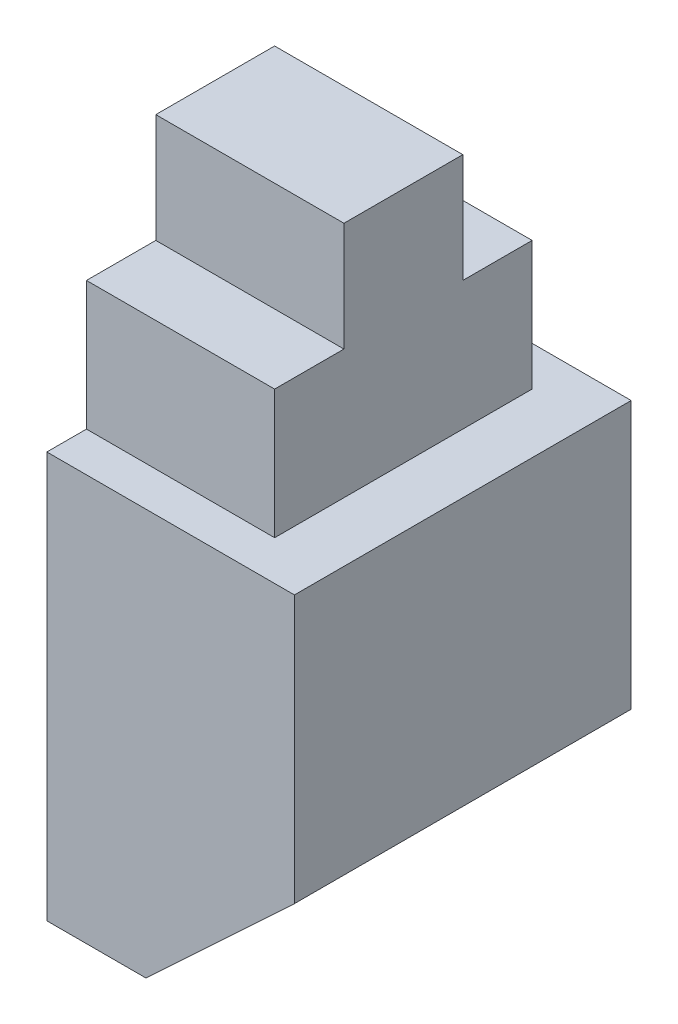
ISO-10303-21;
HEADER;
FILE_DESCRIPTION(('STEP AP214'),'2;1');
FILE_NAME('part.step','',(''),(''),'','','');
FILE_SCHEMA(('AUTOMOTIVE_DESIGN { 1 0 10303 214 1 1 1 1 }'));
ENDSEC;
DATA;
#1=APPLICATION_CONTEXT('core data for automotive mechanical design processes');
#2=APPLICATION_PROTOCOL_DEFINITION('international standard','automotive_design',2000,#1);
#3=PRODUCT_CONTEXT('',#1,'mechanical');
#4=PRODUCT('Part','Part','',(#3));
#5=PRODUCT_RELATED_PRODUCT_CATEGORY('part','',(#4));
#6=PRODUCT_DEFINITION_FORMATION('','',#4);
#7=PRODUCT_DEFINITION_CONTEXT('part definition',#1,'design');
#8=PRODUCT_DEFINITION('design','',#6,#7);
#9=PRODUCT_DEFINITION_SHAPE('','',#8);
#10=(LENGTH_UNIT() NAMED_UNIT(*) SI_UNIT(.MILLI.,.METRE.));
#11=(NAMED_UNIT(*) PLANE_ANGLE_UNIT() SI_UNIT($,.RADIAN.));
#12=(NAMED_UNIT(*) SI_UNIT($,.STERADIAN.) SOLID_ANGLE_UNIT());
#13=UNCERTAINTY_MEASURE_WITH_UNIT(LENGTH_MEASURE(1.E-05),#10,'distance_accuracy_value','');
#14=(GEOMETRIC_REPRESENTATION_CONTEXT(3) GLOBAL_UNCERTAINTY_ASSIGNED_CONTEXT((#13)) GLOBAL_UNIT_ASSIGNED_CONTEXT((#10,
#11,#12)) REPRESENTATION_CONTEXT('',''));
#15=CARTESIAN_POINT('',(0.,0.,0.));
#16=DIRECTION('',(0.,0.,1.));
#17=DIRECTION('',(1.,0.,0.));
#18=AXIS2_PLACEMENT_3D('',#15,#16,#17);
#19=CARTESIAN_POINT('',(-12.5,-20.5,-34.));
#20=DIRECTION('',(0.,-1.,0.));
#21=DIRECTION('',(0.,0.,-1.));
#22=AXIS2_PLACEMENT_3D('',#19,#20,#21);
#23=PLANE('',#22);
#24=DIRECTION('',(-1.,0.,0.));
#25=VECTOR('',#24,1.);
#26=CARTESIAN_POINT('',(12.5,-20.5,-8.));
#27=LINE('',#26,#25);
#28=CARTESIAN_POINT('',(-2.5,-20.5,-8.));
#29=VERTEX_POINT('',#28);
#30=CARTESIAN_POINT('',(-12.5,-20.5,-8.));
#31=VERTEX_POINT('',#30);
#32=EDGE_CURVE('E181',#29,#31,#27,.T.);
#33=ORIENTED_EDGE('',*,*,#32,.F.);
#34=DIRECTION('',(0.,0.,1.));
#35=VECTOR('',#34,1.);
#36=CARTESIAN_POINT('',(-2.5,-20.5,-34.));
#37=LINE('',#36,#35);
#38=CARTESIAN_POINT('',(-2.5,-20.5,0.));
#39=VERTEX_POINT('',#38);
#40=EDGE_CURVE('E281',#29,#39,#37,.T.);
#41=ORIENTED_EDGE('',*,*,#40,.T.);
#42=DIRECTION('',(1.,0.,0.));
#43=VECTOR('',#42,1.);
#44=CARTESIAN_POINT('',(-12.5,-20.5,0.));
#45=LINE('',#44,#43);
#46=CARTESIAN_POINT('',(-12.5,-20.5,0.));
#47=VERTEX_POINT('',#46);
#48=EDGE_CURVE('E270',#47,#39,#45,.T.);
#49=ORIENTED_EDGE('',*,*,#48,.F.);
#50=DIRECTION('',(0.,0.,1.));
#51=VECTOR('',#50,1.);
#52=CARTESIAN_POINT('',(-12.5,-20.5,-34.));
#53=LINE('',#52,#51);
#54=EDGE_CURVE('E282',#31,#47,#53,.T.);
#55=ORIENTED_EDGE('',*,*,#54,.F.);
#56=EDGE_LOOP('',(#33,#41,#49,#55));
#57=FACE_BOUND('',#56,.T.);
#58=ADVANCED_FACE('F35',(#57),#23,.T.);
#59=CARTESIAN_POINT('',(12.5,20.5,-34.));
#60=DIRECTION('',(0.,1.,0.));
#61=DIRECTION('',(0.,0.,1.));
#62=AXIS2_PLACEMENT_3D('',#59,#60,#61);
#63=PLANE('',#62);
#64=DIRECTION('',(-1.,0.,0.));
#65=VECTOR('',#64,1.);
#66=CARTESIAN_POINT('',(6.5,20.5,-30.));
#67=LINE('',#66,#65);
#68=CARTESIAN_POINT('',(6.5,20.5,-30.));
#69=VERTEX_POINT('',#68);
#70=CARTESIAN_POINT('',(-12.5,20.5,-30.));
#71=VERTEX_POINT('',#70);
#72=EDGE_CURVE('E233',#69,#71,#67,.T.);
#73=ORIENTED_EDGE('',*,*,#72,.F.);
#74=DIRECTION('',(0.,0.,1.));
#75=VECTOR('',#74,1.);
#76=CARTESIAN_POINT('',(6.5,20.5,-4.));
#77=LINE('',#76,#75);
#78=CARTESIAN_POINT('',(6.5,20.5,-4.));
#79=VERTEX_POINT('',#78);
#80=EDGE_CURVE('E189',#69,#79,#77,.T.);
#81=ORIENTED_EDGE('',*,*,#80,.T.);
#82=DIRECTION('',(-1.,0.,0.));
#83=VECTOR('',#82,1.);
#84=CARTESIAN_POINT('',(6.5,20.5,-4.));
#85=LINE('',#84,#83);
#86=CARTESIAN_POINT('',(-12.5,20.5,-4.));
#87=VERTEX_POINT('',#86);
#88=EDGE_CURVE('E214',#79,#87,#85,.T.);
#89=ORIENTED_EDGE('',*,*,#88,.T.);
#90=DIRECTION('',(0.,0.,1.));
#91=VECTOR('',#90,1.);
#92=CARTESIAN_POINT('',(-12.5,20.5,-34.));
#93=LINE('',#92,#91);
#94=CARTESIAN_POINT('',(-12.5,20.5,0.));
#95=VERTEX_POINT('',#94);
#96=EDGE_CURVE('E264',#87,#95,#93,.T.);
#97=ORIENTED_EDGE('',*,*,#96,.T.);
#98=DIRECTION('',(-1.,0.,0.));
#99=VECTOR('',#98,1.);
#100=CARTESIAN_POINT('',(12.5,20.5,0.));
#101=LINE('',#100,#99);
#102=CARTESIAN_POINT('',(12.5,20.5,0.));
#103=VERTEX_POINT('',#102);
#104=EDGE_CURVE('E235',#103,#95,#101,.T.);
#105=ORIENTED_EDGE('',*,*,#104,.F.);
#106=DIRECTION('',(0.,0.,1.));
#107=VECTOR('',#106,1.);
#108=CARTESIAN_POINT('',(12.5,20.5,-34.));
#109=LINE('',#108,#107);
#110=CARTESIAN_POINT('',(12.5,20.5,-34.));
#111=VERTEX_POINT('',#110);
#112=EDGE_CURVE('E11',#111,#103,#109,.T.);
#113=ORIENTED_EDGE('',*,*,#112,.F.);
#114=DIRECTION('',(-1.,0.,0.));
#115=VECTOR('',#114,1.);
#116=CARTESIAN_POINT('',(12.5,20.5,-34.));
#117=LINE('',#116,#115);
#118=CARTESIAN_POINT('',(-12.5,20.5,-34.));
#119=VERTEX_POINT('',#118);
#120=EDGE_CURVE('E249',#111,#119,#117,.T.);
#121=ORIENTED_EDGE('',*,*,#120,.T.);
#122=EDGE_CURVE('E39',#119,#71,#93,.T.);
#123=ORIENTED_EDGE('',*,*,#122,.T.);
#124=EDGE_LOOP('',(#73,#81,#89,#97,#105,#113,#121,#123));
#125=FACE_BOUND('',#124,.T.);
#126=ADVANCED_FACE('F37',(#125),#63,.T.);
#127=CARTESIAN_POINT('',(12.5,-6.5,-34.));
#128=DIRECTION('',(1.,0.,0.));
#129=DIRECTION('',(0.,0.,-1.));
#130=AXIS2_PLACEMENT_3D('',#127,#128,#129);
#131=PLANE('',#130);
#132=DIRECTION('',(0.,1.,0.));
#133=VECTOR('',#132,1.);
#134=CARTESIAN_POINT('',(12.5,-6.5,0.));
#135=LINE('',#134,#133);
#136=CARTESIAN_POINT('',(12.5,-6.5,0.));
#137=VERTEX_POINT('',#136);
#138=EDGE_CURVE('E253',#137,#103,#135,.T.);
#139=ORIENTED_EDGE('',*,*,#138,.F.);
#140=DIRECTION('',(0.,0.,1.));
#141=VECTOR('',#140,1.);
#142=CARTESIAN_POINT('',(12.5,-6.5,-34.));
#143=LINE('',#142,#141);
#144=CARTESIAN_POINT('',(12.5,-6.5,-34.));
#145=VERTEX_POINT('',#144);
#146=EDGE_CURVE('E44',#145,#137,#143,.T.);
#147=ORIENTED_EDGE('',*,*,#146,.F.);
#148=DIRECTION('',(0.,1.,0.));
#149=VECTOR('',#148,1.);
#150=CARTESIAN_POINT('',(12.5,-6.5,-34.));
#151=LINE('',#150,#149);
#152=EDGE_CURVE('E261',#145,#111,#151,.T.);
#153=ORIENTED_EDGE('',*,*,#152,.T.);
#154=ORIENTED_EDGE('',*,*,#112,.T.);
#155=EDGE_LOOP('',(#139,#147,#153,#154));
#156=FACE_BOUND('',#155,.T.);
#157=ADVANCED_FACE('F296',(#156),#131,.T.);
#158=CARTESIAN_POINT('',(-2.5,-20.5,-34.));
#159=DIRECTION('',(0.682318250360011,-0.731055268242869,0.));
#160=DIRECTION('',(0.731055268242869,0.682318250360011,0.));
#161=AXIS2_PLACEMENT_3D('',#158,#159,#160);
#162=PLANE('',#161);
#163=DIRECTION('',(-0.731055268242869,-0.682318250360011,0.));
#164=VECTOR('',#163,1.);
#165=CARTESIAN_POINT('',(-2.5,-20.5,-8.));
#166=LINE('',#165,#164);
#167=CARTESIAN_POINT('',(6.07142857142857,-12.5,-8.));
#168=VERTEX_POINT('',#167);
#169=EDGE_CURVE('E187',#168,#29,#166,.T.);
#170=ORIENTED_EDGE('',*,*,#169,.F.);
#171=DIRECTION('',(0.,0.,1.));
#172=VECTOR('',#171,1.);
#173=CARTESIAN_POINT('',(6.07142857142857,-12.5,-34.));
#174=LINE('',#173,#172);
#175=CARTESIAN_POINT('',(6.07142857142857,-12.5,-26.));
#176=VERTEX_POINT('',#175);
#177=EDGE_CURVE('E183',#176,#168,#174,.T.);
#178=ORIENTED_EDGE('',*,*,#177,.F.);
#179=DIRECTION('',(0.731055268242869,0.682318250360011,0.));
#180=VECTOR('',#179,1.);
#181=CARTESIAN_POINT('',(-2.5,-20.5,-26.));
#182=LINE('',#181,#180);
#183=CARTESIAN_POINT('',(-2.5,-20.5,-26.));
#184=VERTEX_POINT('',#183);
#185=EDGE_CURVE('E162',#184,#176,#182,.T.);
#186=ORIENTED_EDGE('',*,*,#185,.F.);
#187=CARTESIAN_POINT('',(-2.5,-20.5,-34.));
#188=VERTEX_POINT('',#187);
#189=EDGE_CURVE('E279',#188,#184,#37,.T.);
#190=ORIENTED_EDGE('',*,*,#189,.F.);
#191=DIRECTION('',(0.731055268242869,0.682318250360011,0.));
#192=VECTOR('',#191,1.);
#193=CARTESIAN_POINT('',(-2.5,-20.5,-34.));
#194=LINE('',#193,#192);
#195=EDGE_CURVE('E258',#188,#145,#194,.T.);
#196=ORIENTED_EDGE('',*,*,#195,.T.);
#197=ORIENTED_EDGE('',*,*,#146,.T.);
#198=DIRECTION('',(0.731055268242869,0.682318250360011,0.));
#199=VECTOR('',#198,1.);
#200=CARTESIAN_POINT('',(-2.5,-20.5,0.));
#201=LINE('',#200,#199);
#202=EDGE_CURVE('E273',#39,#137,#201,.T.);
#203=ORIENTED_EDGE('',*,*,#202,.F.);
#204=ORIENTED_EDGE('',*,*,#40,.F.);
#205=EDGE_LOOP('',(#170,#178,#186,#190,#196,#197,#203,#204));
#206=FACE_BOUND('',#205,.T.);
#207=ADVANCED_FACE('F350',(#206),#162,.T.);
#208=DIRECTION('',(-1.,0.,0.));
#209=VECTOR('',#208,1.);
#210=CARTESIAN_POINT('',(12.5,-20.5,-26.));
#211=LINE('',#210,#209);
#212=CARTESIAN_POINT('',(-12.5,-20.5,-26.));
#213=VERTEX_POINT('',#212);
#214=EDGE_CURVE('E165',#184,#213,#211,.T.);
#215=ORIENTED_EDGE('',*,*,#214,.T.);
#216=CARTESIAN_POINT('',(-12.5,-20.5,-34.));
#217=VERTEX_POINT('',#216);
#218=EDGE_CURVE('E176',#217,#213,#53,.T.);
#219=ORIENTED_EDGE('',*,*,#218,.F.);
#220=DIRECTION('',(1.,0.,0.));
#221=VECTOR('',#220,1.);
#222=CARTESIAN_POINT('',(-12.5,-20.5,-34.));
#223=LINE('',#222,#221);
#224=EDGE_CURVE('E255',#217,#188,#223,.T.);
#225=ORIENTED_EDGE('',*,*,#224,.T.);
#226=ORIENTED_EDGE('',*,*,#189,.T.);
#227=EDGE_LOOP('',(#215,#219,#225,#226));
#228=FACE_BOUND('',#227,.T.);
#229=ADVANCED_FACE('F343',(#228),#23,.T.);
#230=CARTESIAN_POINT('',(-12.5,20.5,-34.));
#231=DIRECTION('',(-1.,0.,0.));
#232=DIRECTION('',(0.,-1.,0.));
#233=AXIS2_PLACEMENT_3D('',#230,#231,#232);
#234=PLANE('',#233);
#235=DIRECTION('',(0.,1.,0.));
#236=VECTOR('',#235,1.);
#237=CARTESIAN_POINT('',(-12.5,-12.5,-8.));
#238=LINE('',#237,#236);
#239=CARTESIAN_POINT('',(-12.5,-12.5,-8.));
#240=VERTEX_POINT('',#239);
#241=EDGE_CURVE('E52',#31,#240,#238,.T.);
#242=ORIENTED_EDGE('',*,*,#241,.F.);
#243=ORIENTED_EDGE('',*,*,#54,.T.);
#244=DIRECTION('',(0.,-1.,0.));
#245=VECTOR('',#244,1.);
#246=CARTESIAN_POINT('',(-12.5,20.5,0.));
#247=LINE('',#246,#245);
#248=EDGE_CURVE('E267',#95,#47,#247,.T.);
#249=ORIENTED_EDGE('',*,*,#248,.F.);
#250=ORIENTED_EDGE('',*,*,#96,.F.);
#251=DIRECTION('',(0.,1.,0.));
#252=VECTOR('',#251,1.);
#253=CARTESIAN_POINT('',(-12.5,33.5,-4.00000000000001));
#254=LINE('',#253,#252);
#255=CARTESIAN_POINT('',(-12.5,33.5,-4.00000000000001));
#256=VERTEX_POINT('',#255);
#257=EDGE_CURVE('E60',#87,#256,#254,.T.);
#258=ORIENTED_EDGE('',*,*,#257,.T.);
#259=DIRECTION('',(0.,0.,-1.));
#260=VECTOR('',#259,1.);
#261=CARTESIAN_POINT('',(-12.5,33.5,-11.));
#262=LINE('',#261,#260);
#263=CARTESIAN_POINT('',(-12.5,33.5,-11.));
#264=VERTEX_POINT('',#263);
#265=EDGE_CURVE('E216',#256,#264,#262,.T.);
#266=ORIENTED_EDGE('',*,*,#265,.T.);
#267=DIRECTION('',(0.,1.,0.));
#268=VECTOR('',#267,1.);
#269=CARTESIAN_POINT('',(-12.5,44.5,-11.));
#270=LINE('',#269,#268);
#271=CARTESIAN_POINT('',(-12.5,44.5,-11.));
#272=VERTEX_POINT('',#271);
#273=EDGE_CURVE('E219',#264,#272,#270,.T.);
#274=ORIENTED_EDGE('',*,*,#273,.T.);
#275=DIRECTION('',(0.,0.,-1.));
#276=VECTOR('',#275,1.);
#277=CARTESIAN_POINT('',(-12.5,44.5,-23.));
#278=LINE('',#277,#276);
#279=CARTESIAN_POINT('',(-12.5,44.5,-23.));
#280=VERTEX_POINT('',#279);
#281=EDGE_CURVE('E222',#272,#280,#278,.T.);
#282=ORIENTED_EDGE('',*,*,#281,.T.);
#283=DIRECTION('',(0.,-1.,0.));
#284=VECTOR('',#283,1.);
#285=CARTESIAN_POINT('',(-12.5,33.5,-23.));
#286=LINE('',#285,#284);
#287=CARTESIAN_POINT('',(-12.5,33.5,-23.));
#288=VERTEX_POINT('',#287);
#289=EDGE_CURVE('E225',#280,#288,#286,.T.);
#290=ORIENTED_EDGE('',*,*,#289,.T.);
#291=DIRECTION('',(0.,0.,-1.));
#292=VECTOR('',#291,1.);
#293=CARTESIAN_POINT('',(-12.5,33.5,-30.));
#294=LINE('',#293,#292);
#295=CARTESIAN_POINT('',(-12.5,33.5,-30.));
#296=VERTEX_POINT('',#295);
#297=EDGE_CURVE('E228',#288,#296,#294,.T.);
#298=ORIENTED_EDGE('',*,*,#297,.T.);
#299=DIRECTION('',(0.,-1.,0.));
#300=VECTOR('',#299,1.);
#301=CARTESIAN_POINT('',(-12.5,20.5,-30.));
#302=LINE('',#301,#300);
#303=EDGE_CURVE('E193',#296,#71,#302,.T.);
#304=ORIENTED_EDGE('',*,*,#303,.T.);
#305=ORIENTED_EDGE('',*,*,#122,.F.);
#306=DIRECTION('',(0.,-1.,0.));
#307=VECTOR('',#306,1.);
#308=CARTESIAN_POINT('',(-12.5,20.5,-34.));
#309=LINE('',#308,#307);
#310=EDGE_CURVE('E252',#119,#217,#309,.T.);
#311=ORIENTED_EDGE('',*,*,#310,.T.);
#312=ORIENTED_EDGE('',*,*,#218,.T.);
#313=DIRECTION('',(0.,-1.,0.));
#314=VECTOR('',#313,1.);
#315=CARTESIAN_POINT('',(-12.5,-12.5,-26.));
#316=LINE('',#315,#314);
#317=CARTESIAN_POINT('',(-12.5,-12.5,-26.));
#318=VERTEX_POINT('',#317);
#319=EDGE_CURVE('E159',#318,#213,#316,.T.);
#320=ORIENTED_EDGE('',*,*,#319,.F.);
#321=DIRECTION('',(0.,0.,-1.));
#322=VECTOR('',#321,1.);
#323=CARTESIAN_POINT('',(-12.5,-12.5,-26.));
#324=LINE('',#323,#322);
#325=EDGE_CURVE('E169',#240,#318,#324,.T.);
#326=ORIENTED_EDGE('',*,*,#325,.F.);
#327=EDGE_LOOP('',(#242,#243,#249,#250,#258,#266,#274,#282,#290,#298,#304,#305,#311,#312,#320,#326));
#328=FACE_BOUND('',#327,.T.);
#329=ADVANCED_FACE('F174',(#328),#234,.T.);
#330=CARTESIAN_POINT('',(0.,0.,-34.));
#331=DIRECTION('',(0.,0.,1.));
#332=DIRECTION('',(1.,0.,0.));
#333=AXIS2_PLACEMENT_3D('',#330,#331,#332);
#334=PLANE('',#333);
#335=ORIENTED_EDGE('',*,*,#120,.F.);
#336=ORIENTED_EDGE('',*,*,#152,.F.);
#337=ORIENTED_EDGE('',*,*,#195,.F.);
#338=ORIENTED_EDGE('',*,*,#224,.F.);
#339=ORIENTED_EDGE('',*,*,#310,.F.);
#340=EDGE_LOOP('',(#335,#336,#337,#338,#339));
#341=FACE_BOUND('',#340,.T.);
#342=ADVANCED_FACE('F301',(#341),#334,.F.);
#343=CARTESIAN_POINT('',(0.,0.,0.));
#344=DIRECTION('',(0.,0.,1.));
#345=DIRECTION('',(1.,0.,0.));
#346=AXIS2_PLACEMENT_3D('',#343,#344,#345);
#347=PLANE('',#346);
#348=ORIENTED_EDGE('',*,*,#104,.T.);
#349=ORIENTED_EDGE('',*,*,#248,.T.);
#350=ORIENTED_EDGE('',*,*,#48,.T.);
#351=ORIENTED_EDGE('',*,*,#202,.T.);
#352=ORIENTED_EDGE('',*,*,#138,.T.);
#353=EDGE_LOOP('',(#348,#349,#350,#351,#352));
#354=FACE_BOUND('',#353,.T.);
#355=ADVANCED_FACE('F292',(#354),#347,.T.);
#356=CARTESIAN_POINT('',(6.5,20.5,-30.));
#357=DIRECTION('',(0.,0.,-1.));
#358=DIRECTION('',(-1.,0.,0.));
#359=AXIS2_PLACEMENT_3D('',#356,#357,#358);
#360=PLANE('',#359);
#361=ORIENTED_EDGE('',*,*,#303,.F.);
#362=DIRECTION('',(-1.,0.,0.));
#363=VECTOR('',#362,1.);
#364=CARTESIAN_POINT('',(6.5,33.5,-30.));
#365=LINE('',#364,#363);
#366=CARTESIAN_POINT('',(6.5,33.5,-30.));
#367=VERTEX_POINT('',#366);
#368=EDGE_CURVE('E236',#367,#296,#365,.T.);
#369=ORIENTED_EDGE('',*,*,#368,.F.);
#370=DIRECTION('',(0.,-1.,0.));
#371=VECTOR('',#370,1.);
#372=CARTESIAN_POINT('',(6.5,20.5,-30.));
#373=LINE('',#372,#371);
#374=EDGE_CURVE('E211',#367,#69,#373,.T.);
#375=ORIENTED_EDGE('',*,*,#374,.T.);
#376=ORIENTED_EDGE('',*,*,#72,.T.);
#377=EDGE_LOOP('',(#361,#369,#375,#376));
#378=FACE_BOUND('',#377,.T.);
#379=ADVANCED_FACE('F307',(#378),#360,.T.);
#380=CARTESIAN_POINT('',(6.5,33.5,-30.));
#381=DIRECTION('',(0.,1.,0.));
#382=DIRECTION('',(-1.,0.,0.));
#383=AXIS2_PLACEMENT_3D('',#380,#381,#382);
#384=PLANE('',#383);
#385=ORIENTED_EDGE('',*,*,#297,.F.);
#386=DIRECTION('',(-1.,0.,0.));
#387=VECTOR('',#386,1.);
#388=CARTESIAN_POINT('',(6.5,33.5,-23.));
#389=LINE('',#388,#387);
#390=CARTESIAN_POINT('',(6.5,33.5,-23.));
#391=VERTEX_POINT('',#390);
#392=EDGE_CURVE('E238',#391,#288,#389,.T.);
#393=ORIENTED_EDGE('',*,*,#392,.F.);
#394=DIRECTION('',(0.,0.,-1.));
#395=VECTOR('',#394,1.);
#396=CARTESIAN_POINT('',(6.5,33.5,-30.));
#397=LINE('',#396,#395);
#398=EDGE_CURVE('E208',#391,#367,#397,.T.);
#399=ORIENTED_EDGE('',*,*,#398,.T.);
#400=ORIENTED_EDGE('',*,*,#368,.T.);
#401=EDGE_LOOP('',(#385,#393,#399,#400));
#402=FACE_BOUND('',#401,.T.);
#403=ADVANCED_FACE('F331',(#402),#384,.T.);
#404=CARTESIAN_POINT('',(6.5,33.5,-23.));
#405=DIRECTION('',(0.,0.,-1.));
#406=DIRECTION('',(-1.,0.,0.));
#407=AXIS2_PLACEMENT_3D('',#404,#405,#406);
#408=PLANE('',#407);
#409=ORIENTED_EDGE('',*,*,#289,.F.);
#410=DIRECTION('',(-1.,0.,0.));
#411=VECTOR('',#410,1.);
#412=CARTESIAN_POINT('',(6.5,44.5,-23.));
#413=LINE('',#412,#411);
#414=CARTESIAN_POINT('',(6.5,44.5,-23.));
#415=VERTEX_POINT('',#414);
#416=EDGE_CURVE('E240',#415,#280,#413,.T.);
#417=ORIENTED_EDGE('',*,*,#416,.F.);
#418=DIRECTION('',(0.,-1.,0.));
#419=VECTOR('',#418,1.);
#420=CARTESIAN_POINT('',(6.5,33.5,-23.));
#421=LINE('',#420,#419);
#422=EDGE_CURVE('E205',#415,#391,#421,.T.);
#423=ORIENTED_EDGE('',*,*,#422,.T.);
#424=ORIENTED_EDGE('',*,*,#392,.T.);
#425=EDGE_LOOP('',(#409,#417,#423,#424));
#426=FACE_BOUND('',#425,.T.);
#427=ADVANCED_FACE('F329',(#426),#408,.T.);
#428=CARTESIAN_POINT('',(6.5,44.5,-23.));
#429=DIRECTION('',(0.,1.,0.));
#430=DIRECTION('',(-1.,0.,0.));
#431=AXIS2_PLACEMENT_3D('',#428,#429,#430);
#432=PLANE('',#431);
#433=ORIENTED_EDGE('',*,*,#281,.F.);
#434=DIRECTION('',(-1.,0.,0.));
#435=VECTOR('',#434,1.);
#436=CARTESIAN_POINT('',(6.5,44.5,-11.));
#437=LINE('',#436,#435);
#438=CARTESIAN_POINT('',(6.5,44.5,-11.));
#439=VERTEX_POINT('',#438);
#440=EDGE_CURVE('E242',#439,#272,#437,.T.);
#441=ORIENTED_EDGE('',*,*,#440,.F.);
#442=DIRECTION('',(0.,0.,-1.));
#443=VECTOR('',#442,1.);
#444=CARTESIAN_POINT('',(6.5,44.5,-23.));
#445=LINE('',#444,#443);
#446=EDGE_CURVE('E202',#439,#415,#445,.T.);
#447=ORIENTED_EDGE('',*,*,#446,.T.);
#448=ORIENTED_EDGE('',*,*,#416,.T.);
#449=EDGE_LOOP('',(#433,#441,#447,#448));
#450=FACE_BOUND('',#449,.T.);
#451=ADVANCED_FACE('F325',(#450),#432,.T.);
#452=CARTESIAN_POINT('',(6.5,44.5,-11.));
#453=DIRECTION('',(0.,0.,1.));
#454=DIRECTION('',(0.,-1.,0.));
#455=AXIS2_PLACEMENT_3D('',#452,#453,#454);
#456=PLANE('',#455);
#457=ORIENTED_EDGE('',*,*,#273,.F.);
#458=DIRECTION('',(-1.,0.,0.));
#459=VECTOR('',#458,1.);
#460=CARTESIAN_POINT('',(6.5,33.5,-11.));
#461=LINE('',#460,#459);
#462=CARTESIAN_POINT('',(6.5,33.5,-11.));
#463=VERTEX_POINT('',#462);
#464=EDGE_CURVE('E244',#463,#264,#461,.T.);
#465=ORIENTED_EDGE('',*,*,#464,.F.);
#466=DIRECTION('',(0.,1.,0.));
#467=VECTOR('',#466,1.);
#468=CARTESIAN_POINT('',(6.5,44.5,-11.));
#469=LINE('',#468,#467);
#470=EDGE_CURVE('E199',#463,#439,#469,.T.);
#471=ORIENTED_EDGE('',*,*,#470,.T.);
#472=ORIENTED_EDGE('',*,*,#440,.T.);
#473=EDGE_LOOP('',(#457,#465,#471,#472));
#474=FACE_BOUND('',#473,.T.);
#475=ADVANCED_FACE('F322',(#474),#456,.T.);
#476=CARTESIAN_POINT('',(6.5,33.5,-11.));
#477=DIRECTION('',(0.,1.,0.));
#478=DIRECTION('',(0.,0.,1.));
#479=AXIS2_PLACEMENT_3D('',#476,#477,#478);
#480=PLANE('',#479);
#481=ORIENTED_EDGE('',*,*,#265,.F.);
#482=DIRECTION('',(-1.,0.,0.));
#483=VECTOR('',#482,1.);
#484=CARTESIAN_POINT('',(6.5,33.5,-4.00000000000001));
#485=LINE('',#484,#483);
#486=CARTESIAN_POINT('',(6.5,33.5,-4.00000000000001));
#487=VERTEX_POINT('',#486);
#488=EDGE_CURVE('E246',#487,#256,#485,.T.);
#489=ORIENTED_EDGE('',*,*,#488,.F.);
#490=DIRECTION('',(0.,0.,-1.));
#491=VECTOR('',#490,1.);
#492=CARTESIAN_POINT('',(6.5,33.5,-11.));
#493=LINE('',#492,#491);
#494=EDGE_CURVE('E196',#487,#463,#493,.T.);
#495=ORIENTED_EDGE('',*,*,#494,.T.);
#496=ORIENTED_EDGE('',*,*,#464,.T.);
#497=EDGE_LOOP('',(#481,#489,#495,#496));
#498=FACE_BOUND('',#497,.T.);
#499=ADVANCED_FACE('F318',(#498),#480,.T.);
#500=CARTESIAN_POINT('',(6.5,33.5,-4.00000000000001));
#501=DIRECTION('',(0.,0.,1.));
#502=DIRECTION('',(0.,-1.,0.));
#503=AXIS2_PLACEMENT_3D('',#500,#501,#502);
#504=PLANE('',#503);
#505=ORIENTED_EDGE('',*,*,#257,.F.);
#506=ORIENTED_EDGE('',*,*,#88,.F.);
#507=DIRECTION('',(0.,1.,0.));
#508=VECTOR('',#507,1.);
#509=CARTESIAN_POINT('',(6.5,33.5,-4.00000000000001));
#510=LINE('',#509,#508);
#511=EDGE_CURVE('E192',#79,#487,#510,.T.);
#512=ORIENTED_EDGE('',*,*,#511,.T.);
#513=ORIENTED_EDGE('',*,*,#488,.T.);
#514=EDGE_LOOP('',(#505,#506,#512,#513));
#515=FACE_BOUND('',#514,.T.);
#516=ADVANCED_FACE('F315',(#515),#504,.T.);
#517=CARTESIAN_POINT('',(6.5,0.,0.));
#518=DIRECTION('',(1.,0.,0.));
#519=DIRECTION('',(0.,1.,0.));
#520=AXIS2_PLACEMENT_3D('',#517,#518,#519);
#521=PLANE('',#520);
#522=ORIENTED_EDGE('',*,*,#80,.F.);
#523=ORIENTED_EDGE('',*,*,#374,.F.);
#524=ORIENTED_EDGE('',*,*,#398,.F.);
#525=ORIENTED_EDGE('',*,*,#422,.F.);
#526=ORIENTED_EDGE('',*,*,#446,.F.);
#527=ORIENTED_EDGE('',*,*,#470,.F.);
#528=ORIENTED_EDGE('',*,*,#494,.F.);
#529=ORIENTED_EDGE('',*,*,#511,.F.);
#530=EDGE_LOOP('',(#522,#523,#524,#525,#526,#527,#528,#529));
#531=FACE_BOUND('',#530,.T.);
#532=ADVANCED_FACE('F311',(#531),#521,.T.);
#533=CARTESIAN_POINT('',(12.5,-12.5,-8.));
#534=DIRECTION('',(0.,0.,1.));
#535=DIRECTION('',(0.,-1.,0.));
#536=AXIS2_PLACEMENT_3D('',#533,#534,#535);
#537=PLANE('',#536);
#538=ORIENTED_EDGE('',*,*,#169,.T.);
#539=ORIENTED_EDGE('',*,*,#32,.T.);
#540=ORIENTED_EDGE('',*,*,#241,.T.);
#541=DIRECTION('',(-1.,0.,0.));
#542=VECTOR('',#541,1.);
#543=CARTESIAN_POINT('',(12.5,-12.5,-8.));
#544=LINE('',#543,#542);
#545=EDGE_CURVE('E166',#168,#240,#544,.T.);
#546=ORIENTED_EDGE('',*,*,#545,.F.);
#547=EDGE_LOOP('',(#538,#539,#540,#546));
#548=FACE_BOUND('',#547,.T.);
#549=ADVANCED_FACE('F359',(#548),#537,.F.);
#550=CARTESIAN_POINT('',(12.5,-12.5,-26.));
#551=DIRECTION('',(0.,0.,-1.));
#552=DIRECTION('',(0.,1.,0.));
#553=AXIS2_PLACEMENT_3D('',#550,#551,#552);
#554=PLANE('',#553);
#555=ORIENTED_EDGE('',*,*,#185,.T.);
#556=DIRECTION('',(-1.,0.,0.));
#557=VECTOR('',#556,1.);
#558=CARTESIAN_POINT('',(12.5,-12.5,-26.));
#559=LINE('',#558,#557);
#560=EDGE_CURVE('E155',#176,#318,#559,.T.);
#561=ORIENTED_EDGE('',*,*,#560,.T.);
#562=ORIENTED_EDGE('',*,*,#319,.T.);
#563=ORIENTED_EDGE('',*,*,#214,.F.);
#564=EDGE_LOOP('',(#555,#561,#562,#563));
#565=FACE_BOUND('',#564,.T.);
#566=ADVANCED_FACE('F157',(#565),#554,.F.);
#567=CARTESIAN_POINT('',(12.5,-12.5,-26.));
#568=DIRECTION('',(0.,1.,0.));
#569=DIRECTION('',(-1.,0.,0.));
#570=AXIS2_PLACEMENT_3D('',#567,#568,#569);
#571=PLANE('',#570);
#572=ORIENTED_EDGE('',*,*,#177,.T.);
#573=ORIENTED_EDGE('',*,*,#545,.T.);
#574=ORIENTED_EDGE('',*,*,#325,.T.);
#575=ORIENTED_EDGE('',*,*,#560,.F.);
#576=EDGE_LOOP('',(#572,#573,#574,#575));
#577=FACE_BOUND('',#576,.T.);
#578=ADVANCED_FACE('F170',(#577),#571,.F.);
#579=CLOSED_SHELL('',(#58,#126,#157,#207,#229,#329,#342,#355,#379,#403,#427,#451,#475,#499,#516,
#532,#549,#566,#578));
#580=MANIFOLD_SOLID_BREP('B2',#579);
#581=ADVANCED_BREP_SHAPE_REPRESENTATION('',(#18,#580),#14);
#582=SHAPE_DEFINITION_REPRESENTATION(#9,#581);
ENDSEC;
END-ISO-10303-21;
